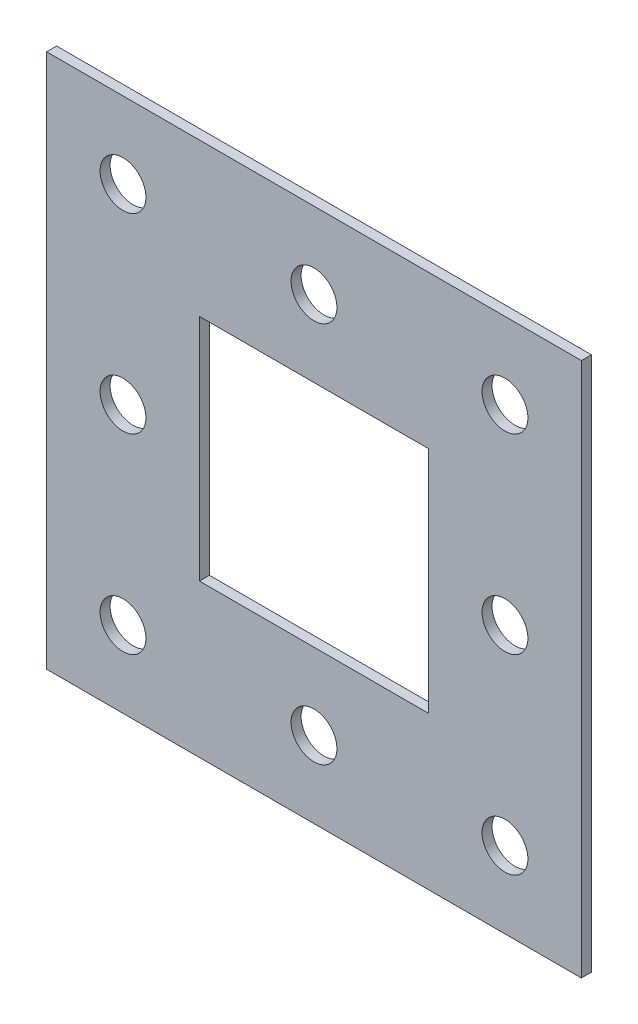
ISO-10303-21;
HEADER;
FILE_DESCRIPTION(('STEP AP214'),'2;1');
FILE_NAME('part.step','',(''),(''),'','','');
FILE_SCHEMA(('AUTOMOTIVE_DESIGN { 1 0 10303 214 1 1 1 1 }'));
ENDSEC;
DATA;
#1=APPLICATION_CONTEXT('core data for automotive mechanical design processes');
#2=APPLICATION_PROTOCOL_DEFINITION('international standard','automotive_design',2000,#1);
#3=PRODUCT_CONTEXT('',#1,'mechanical');
#4=PRODUCT('Part','Part','',(#3));
#5=PRODUCT_RELATED_PRODUCT_CATEGORY('part','',(#4));
#6=PRODUCT_DEFINITION_FORMATION('','',#4);
#7=PRODUCT_DEFINITION_CONTEXT('part definition',#1,'design');
#8=PRODUCT_DEFINITION('design','',#6,#7);
#9=PRODUCT_DEFINITION_SHAPE('','',#8);
#10=(LENGTH_UNIT() NAMED_UNIT(*) SI_UNIT(.MILLI.,.METRE.));
#11=(NAMED_UNIT(*) PLANE_ANGLE_UNIT() SI_UNIT($,.RADIAN.));
#12=(NAMED_UNIT(*) SI_UNIT($,.STERADIAN.) SOLID_ANGLE_UNIT());
#13=UNCERTAINTY_MEASURE_WITH_UNIT(LENGTH_MEASURE(1.E-05),#10,'distance_accuracy_value','');
#14=(GEOMETRIC_REPRESENTATION_CONTEXT(3) GLOBAL_UNCERTAINTY_ASSIGNED_CONTEXT((#13)) GLOBAL_UNIT_ASSIGNED_CONTEXT((#10,
#11,#12)) REPRESENTATION_CONTEXT('',''));
#15=CARTESIAN_POINT('',(0.,0.,0.));
#16=DIRECTION('',(0.,0.,1.));
#17=DIRECTION('',(1.,0.,0.));
#18=AXIS2_PLACEMENT_3D('',#15,#16,#17);
#19=CARTESIAN_POINT('',(35.,-35.,1.31));
#20=DIRECTION('',(-1.,0.,0.));
#21=DIRECTION('',(0.,0.,1.));
#22=AXIS2_PLACEMENT_3D('',#19,#20,#21);
#23=PLANE('',#22);
#24=DIRECTION('',(0.,1.,0.));
#25=VECTOR('',#24,1.);
#26=CARTESIAN_POINT('',(35.,-35.,0.));
#27=LINE('',#26,#25);
#28=CARTESIAN_POINT('',(35.,-35.,0.));
#29=VERTEX_POINT('',#28);
#30=CARTESIAN_POINT('',(35.,35.,0.));
#31=VERTEX_POINT('',#30);
#32=EDGE_CURVE('E155',#29,#31,#27,.T.);
#33=ORIENTED_EDGE('',*,*,#32,.T.);
#34=DIRECTION('',(0.,0.,-1.));
#35=VECTOR('',#34,1.);
#36=CARTESIAN_POINT('',(35.,35.,1.31));
#37=LINE('',#36,#35);
#38=CARTESIAN_POINT('',(35.,35.,1.31));
#39=VERTEX_POINT('',#38);
#40=EDGE_CURVE('E182',#39,#31,#37,.T.);
#41=ORIENTED_EDGE('',*,*,#40,.F.);
#42=DIRECTION('',(0.,1.,0.));
#43=VECTOR('',#42,1.);
#44=CARTESIAN_POINT('',(35.,-35.,1.31));
#45=LINE('',#44,#43);
#46=CARTESIAN_POINT('',(35.,-35.,1.31));
#47=VERTEX_POINT('',#46);
#48=EDGE_CURVE('E156',#47,#39,#45,.T.);
#49=ORIENTED_EDGE('',*,*,#48,.F.);
#50=DIRECTION('',(0.,0.,-1.));
#51=VECTOR('',#50,1.);
#52=CARTESIAN_POINT('',(35.,-35.,1.31));
#53=LINE('',#52,#51);
#54=EDGE_CURVE('E166',#47,#29,#53,.T.);
#55=ORIENTED_EDGE('',*,*,#54,.T.);
#56=EDGE_LOOP('',(#33,#41,#49,#55));
#57=FACE_BOUND('',#56,.T.);
#58=ADVANCED_FACE('F35',(#57),#23,.F.);
#59=CARTESIAN_POINT('',(-35.,35.,1.31));
#60=DIRECTION('',(0.,-1.,0.));
#61=DIRECTION('',(0.,0.,-1.));
#62=AXIS2_PLACEMENT_3D('',#59,#60,#61);
#63=PLANE('',#62);
#64=DIRECTION('',(-1.,0.,0.));
#65=VECTOR('',#64,1.);
#66=CARTESIAN_POINT('',(-35.,35.,0.));
#67=LINE('',#66,#65);
#68=CARTESIAN_POINT('',(-35.,35.,0.));
#69=VERTEX_POINT('',#68);
#70=EDGE_CURVE('E169',#31,#69,#67,.T.);
#71=ORIENTED_EDGE('',*,*,#70,.T.);
#72=DIRECTION('',(0.,0.,-1.));
#73=VECTOR('',#72,1.);
#74=CARTESIAN_POINT('',(-35.,35.,1.31));
#75=LINE('',#74,#73);
#76=CARTESIAN_POINT('',(-35.,35.,1.31));
#77=VERTEX_POINT('',#76);
#78=EDGE_CURVE('E179',#77,#69,#75,.T.);
#79=ORIENTED_EDGE('',*,*,#78,.F.);
#80=DIRECTION('',(-1.,0.,0.));
#81=VECTOR('',#80,1.);
#82=CARTESIAN_POINT('',(-35.,35.,1.31));
#83=LINE('',#82,#81);
#84=EDGE_CURVE('E159',#39,#77,#83,.T.);
#85=ORIENTED_EDGE('',*,*,#84,.F.);
#86=ORIENTED_EDGE('',*,*,#40,.T.);
#87=EDGE_LOOP('',(#71,#79,#85,#86));
#88=FACE_BOUND('',#87,.T.);
#89=ADVANCED_FACE('F243',(#88),#63,.F.);
#90=CARTESIAN_POINT('',(-35.,-35.,1.31));
#91=DIRECTION('',(1.,0.,0.));
#92=DIRECTION('',(0.,0.,-1.));
#93=AXIS2_PLACEMENT_3D('',#90,#91,#92);
#94=PLANE('',#93);
#95=DIRECTION('',(0.,-1.,0.));
#96=VECTOR('',#95,1.);
#97=CARTESIAN_POINT('',(-35.,-35.,0.));
#98=LINE('',#97,#96);
#99=CARTESIAN_POINT('',(-35.,-35.,0.));
#100=VERTEX_POINT('',#99);
#101=EDGE_CURVE('E171',#69,#100,#98,.T.);
#102=ORIENTED_EDGE('',*,*,#101,.T.);
#103=DIRECTION('',(0.,0.,-1.));
#104=VECTOR('',#103,1.);
#105=CARTESIAN_POINT('',(-35.,-35.,1.31));
#106=LINE('',#105,#104);
#107=CARTESIAN_POINT('',(-35.,-35.,1.31));
#108=VERTEX_POINT('',#107);
#109=EDGE_CURVE('E176',#108,#100,#106,.T.);
#110=ORIENTED_EDGE('',*,*,#109,.F.);
#111=DIRECTION('',(0.,-1.,0.));
#112=VECTOR('',#111,1.);
#113=CARTESIAN_POINT('',(-35.,-35.,1.31));
#114=LINE('',#113,#112);
#115=EDGE_CURVE('E162',#77,#108,#114,.T.);
#116=ORIENTED_EDGE('',*,*,#115,.F.);
#117=ORIENTED_EDGE('',*,*,#78,.T.);
#118=EDGE_LOOP('',(#102,#110,#116,#117));
#119=FACE_BOUND('',#118,.T.);
#120=ADVANCED_FACE('F240',(#119),#94,.F.);
#121=CARTESIAN_POINT('',(-35.,-35.,1.31));
#122=DIRECTION('',(0.,1.,0.));
#123=DIRECTION('',(0.,0.,1.));
#124=AXIS2_PLACEMENT_3D('',#121,#122,#123);
#125=PLANE('',#124);
#126=DIRECTION('',(1.,0.,0.));
#127=VECTOR('',#126,1.);
#128=CARTESIAN_POINT('',(-35.,-35.,0.));
#129=LINE('',#128,#127);
#130=EDGE_CURVE('E160',#100,#29,#129,.T.);
#131=ORIENTED_EDGE('',*,*,#130,.T.);
#132=ORIENTED_EDGE('',*,*,#54,.F.);
#133=DIRECTION('',(1.,0.,0.));
#134=VECTOR('',#133,1.);
#135=CARTESIAN_POINT('',(-35.,-35.,1.31));
#136=LINE('',#135,#134);
#137=EDGE_CURVE('E164',#108,#47,#136,.T.);
#138=ORIENTED_EDGE('',*,*,#137,.F.);
#139=ORIENTED_EDGE('',*,*,#109,.T.);
#140=EDGE_LOOP('',(#131,#132,#138,#139));
#141=FACE_BOUND('',#140,.T.);
#142=ADVANCED_FACE('F236',(#141),#125,.F.);
#143=CARTESIAN_POINT('',(0.,0.,1.31));
#144=DIRECTION('',(0.,0.,-1.));
#145=DIRECTION('',(-1.,0.,0.));
#146=AXIS2_PLACEMENT_3D('',#143,#144,#145);
#147=PLANE('',#146);
#148=CARTESIAN_POINT('',(-25.,25.,1.31));
#149=DIRECTION('',(0.,0.,-1.));
#150=DIRECTION('',(-1.,0.,0.));
#151=AXIS2_PLACEMENT_3D('',#148,#149,#150);
#152=CIRCLE('',#151,3.);
#153=CARTESIAN_POINT('',(-28.,25.,1.31));
#154=VERTEX_POINT('',#153);
#155=EDGE_CURVE('E152',#154,#154,#152,.T.);
#156=ORIENTED_EDGE('',*,*,#155,.T.);
#157=EDGE_LOOP('',(#156));
#158=FACE_BOUND('',#157,.T.);
#159=CARTESIAN_POINT('',(0.,25.,1.31));
#160=DIRECTION('',(0.,0.,-1.));
#161=DIRECTION('',(-1.,0.,0.));
#162=AXIS2_PLACEMENT_3D('',#159,#160,#161);
#163=CIRCLE('',#162,3.);
#164=CARTESIAN_POINT('',(-2.99999999999999,25.,1.31));
#165=VERTEX_POINT('',#164);
#166=EDGE_CURVE('E149',#165,#165,#163,.T.);
#167=ORIENTED_EDGE('',*,*,#166,.T.);
#168=EDGE_LOOP('',(#167));
#169=FACE_BOUND('',#168,.T.);
#170=CARTESIAN_POINT('',(25.,25.,1.31));
#171=DIRECTION('',(0.,0.,-1.));
#172=DIRECTION('',(-1.,0.,0.));
#173=AXIS2_PLACEMENT_3D('',#170,#171,#172);
#174=CIRCLE('',#173,3.);
#175=CARTESIAN_POINT('',(22.,25.,1.31));
#176=VERTEX_POINT('',#175);
#177=EDGE_CURVE('E145',#176,#176,#174,.T.);
#178=ORIENTED_EDGE('',*,*,#177,.T.);
#179=EDGE_LOOP('',(#178));
#180=FACE_BOUND('',#179,.T.);
#181=CARTESIAN_POINT('',(25.,0.,1.31));
#182=DIRECTION('',(0.,0.,-1.));
#183=DIRECTION('',(-1.,0.,0.));
#184=AXIS2_PLACEMENT_3D('',#181,#182,#183);
#185=CIRCLE('',#184,3.);
#186=CARTESIAN_POINT('',(22.,0.,1.31));
#187=VERTEX_POINT('',#186);
#188=EDGE_CURVE('E141',#187,#187,#185,.T.);
#189=ORIENTED_EDGE('',*,*,#188,.T.);
#190=EDGE_LOOP('',(#189));
#191=FACE_BOUND('',#190,.T.);
#192=CARTESIAN_POINT('',(25.,-25.,1.31));
#193=DIRECTION('',(0.,0.,-1.));
#194=DIRECTION('',(-1.,0.,0.));
#195=AXIS2_PLACEMENT_3D('',#192,#193,#194);
#196=CIRCLE('',#195,3.);
#197=CARTESIAN_POINT('',(22.,-25.,1.31));
#198=VERTEX_POINT('',#197);
#199=EDGE_CURVE('E137',#198,#198,#196,.T.);
#200=ORIENTED_EDGE('',*,*,#199,.T.);
#201=EDGE_LOOP('',(#200));
#202=FACE_BOUND('',#201,.T.);
#203=CARTESIAN_POINT('',(0.,-25.,1.31));
#204=DIRECTION('',(0.,0.,-1.));
#205=DIRECTION('',(-1.,0.,0.));
#206=AXIS2_PLACEMENT_3D('',#203,#204,#205);
#207=CIRCLE('',#206,3.);
#208=CARTESIAN_POINT('',(-2.99999999999999,-25.,1.31));
#209=VERTEX_POINT('',#208);
#210=EDGE_CURVE('E133',#209,#209,#207,.T.);
#211=ORIENTED_EDGE('',*,*,#210,.T.);
#212=EDGE_LOOP('',(#211));
#213=FACE_BOUND('',#212,.T.);
#214=CARTESIAN_POINT('',(-25.,-25.,1.31));
#215=DIRECTION('',(0.,0.,-1.));
#216=DIRECTION('',(-1.,0.,0.));
#217=AXIS2_PLACEMENT_3D('',#214,#215,#216);
#218=CIRCLE('',#217,3.);
#219=CARTESIAN_POINT('',(-28.,-25.,1.31));
#220=VERTEX_POINT('',#219);
#221=EDGE_CURVE('E129',#220,#220,#218,.T.);
#222=ORIENTED_EDGE('',*,*,#221,.T.);
#223=EDGE_LOOP('',(#222));
#224=FACE_BOUND('',#223,.T.);
#225=CARTESIAN_POINT('',(-25.,0.,1.31));
#226=DIRECTION('',(0.,0.,-1.));
#227=DIRECTION('',(-1.,0.,0.));
#228=AXIS2_PLACEMENT_3D('',#225,#226,#227);
#229=CIRCLE('',#228,3.);
#230=CARTESIAN_POINT('',(-28.,0.,1.31));
#231=VERTEX_POINT('',#230);
#232=EDGE_CURVE('E125',#231,#231,#229,.T.);
#233=ORIENTED_EDGE('',*,*,#232,.T.);
#234=EDGE_LOOP('',(#233));
#235=FACE_BOUND('',#234,.T.);
#236=DIRECTION('',(1.,0.,0.));
#237=VECTOR('',#236,1.);
#238=CARTESIAN_POINT('',(0.,15.,1.31));
#239=LINE('',#238,#237);
#240=CARTESIAN_POINT('',(-15.,15.,1.31));
#241=VERTEX_POINT('',#240);
#242=CARTESIAN_POINT('',(15.,15.,1.31));
#243=VERTEX_POINT('',#242);
#244=EDGE_CURVE('E97',#241,#243,#239,.T.);
#245=ORIENTED_EDGE('',*,*,#244,.T.);
#246=DIRECTION('',(0.,-1.,0.));
#247=VECTOR('',#246,1.);
#248=CARTESIAN_POINT('',(15.,0.,1.31));
#249=LINE('',#248,#247);
#250=CARTESIAN_POINT('',(15.,-15.,1.31));
#251=VERTEX_POINT('',#250);
#252=EDGE_CURVE('E119',#243,#251,#249,.T.);
#253=ORIENTED_EDGE('',*,*,#252,.T.);
#254=DIRECTION('',(-1.,0.,0.));
#255=VECTOR('',#254,1.);
#256=CARTESIAN_POINT('',(0.,-15.,1.31));
#257=LINE('',#256,#255);
#258=CARTESIAN_POINT('',(-15.,-15.,1.31));
#259=VERTEX_POINT('',#258);
#260=EDGE_CURVE('E117',#251,#259,#257,.T.);
#261=ORIENTED_EDGE('',*,*,#260,.T.);
#262=DIRECTION('',(0.,1.,0.));
#263=VECTOR('',#262,1.);
#264=CARTESIAN_POINT('',(-15.,0.,1.31));
#265=LINE('',#264,#263);
#266=EDGE_CURVE('E102',#259,#241,#265,.T.);
#267=ORIENTED_EDGE('',*,*,#266,.T.);
#268=EDGE_LOOP('',(#245,#253,#261,#267));
#269=FACE_BOUND('',#268,.T.);
#270=ORIENTED_EDGE('',*,*,#48,.T.);
#271=ORIENTED_EDGE('',*,*,#84,.T.);
#272=ORIENTED_EDGE('',*,*,#115,.T.);
#273=ORIENTED_EDGE('',*,*,#137,.T.);
#274=EDGE_LOOP('',(#270,#271,#272,#273));
#275=FACE_BOUND('',#274,.T.);
#276=ADVANCED_FACE('F115',(#158,#169,#180,#191,#202,#213,#224,#235,#269,#275),#147,.F.);
#277=CARTESIAN_POINT('',(0.,0.,0.));
#278=DIRECTION('',(0.,0.,-1.));
#279=DIRECTION('',(-1.,0.,0.));
#280=AXIS2_PLACEMENT_3D('',#277,#278,#279);
#281=PLANE('',#280);
#282=CARTESIAN_POINT('',(-25.,25.,0.));
#283=DIRECTION('',(0.,0.,-1.));
#284=DIRECTION('',(-1.,0.,0.));
#285=AXIS2_PLACEMENT_3D('',#282,#283,#284);
#286=CIRCLE('',#285,3.);
#287=CARTESIAN_POINT('',(-28.,25.,0.));
#288=VERTEX_POINT('',#287);
#289=EDGE_CURVE('E38',#288,#288,#286,.T.);
#290=ORIENTED_EDGE('',*,*,#289,.F.);
#291=EDGE_LOOP('',(#290));
#292=FACE_BOUND('',#291,.T.);
#293=CARTESIAN_POINT('',(0.,25.,0.));
#294=DIRECTION('',(0.,0.,-1.));
#295=DIRECTION('',(-1.,0.,0.));
#296=AXIS2_PLACEMENT_3D('',#293,#294,#295);
#297=CIRCLE('',#296,3.);
#298=CARTESIAN_POINT('',(-2.99999999999999,25.,0.));
#299=VERTEX_POINT('',#298);
#300=EDGE_CURVE('E148',#299,#299,#297,.T.);
#301=ORIENTED_EDGE('',*,*,#300,.F.);
#302=EDGE_LOOP('',(#301));
#303=FACE_BOUND('',#302,.T.);
#304=CARTESIAN_POINT('',(25.,25.,0.));
#305=DIRECTION('',(0.,0.,-1.));
#306=DIRECTION('',(-1.,0.,0.));
#307=AXIS2_PLACEMENT_3D('',#304,#305,#306);
#308=CIRCLE('',#307,3.);
#309=CARTESIAN_POINT('',(22.,25.,0.));
#310=VERTEX_POINT('',#309);
#311=EDGE_CURVE('E144',#310,#310,#308,.T.);
#312=ORIENTED_EDGE('',*,*,#311,.F.);
#313=EDGE_LOOP('',(#312));
#314=FACE_BOUND('',#313,.T.);
#315=CARTESIAN_POINT('',(25.,0.,0.));
#316=DIRECTION('',(0.,0.,-1.));
#317=DIRECTION('',(-1.,0.,0.));
#318=AXIS2_PLACEMENT_3D('',#315,#316,#317);
#319=CIRCLE('',#318,3.);
#320=CARTESIAN_POINT('',(22.,0.,0.));
#321=VERTEX_POINT('',#320);
#322=EDGE_CURVE('E140',#321,#321,#319,.T.);
#323=ORIENTED_EDGE('',*,*,#322,.F.);
#324=EDGE_LOOP('',(#323));
#325=FACE_BOUND('',#324,.T.);
#326=CARTESIAN_POINT('',(25.,-25.,0.));
#327=DIRECTION('',(0.,0.,-1.));
#328=DIRECTION('',(-1.,0.,0.));
#329=AXIS2_PLACEMENT_3D('',#326,#327,#328);
#330=CIRCLE('',#329,3.);
#331=CARTESIAN_POINT('',(22.,-25.,0.));
#332=VERTEX_POINT('',#331);
#333=EDGE_CURVE('E136',#332,#332,#330,.T.);
#334=ORIENTED_EDGE('',*,*,#333,.F.);
#335=EDGE_LOOP('',(#334));
#336=FACE_BOUND('',#335,.T.);
#337=CARTESIAN_POINT('',(0.,-25.,0.));
#338=DIRECTION('',(0.,0.,-1.));
#339=DIRECTION('',(-1.,0.,0.));
#340=AXIS2_PLACEMENT_3D('',#337,#338,#339);
#341=CIRCLE('',#340,3.);
#342=CARTESIAN_POINT('',(-2.99999999999999,-25.,0.));
#343=VERTEX_POINT('',#342);
#344=EDGE_CURVE('E132',#343,#343,#341,.T.);
#345=ORIENTED_EDGE('',*,*,#344,.F.);
#346=EDGE_LOOP('',(#345));
#347=FACE_BOUND('',#346,.T.);
#348=CARTESIAN_POINT('',(-25.,-25.,0.));
#349=DIRECTION('',(0.,0.,-1.));
#350=DIRECTION('',(-1.,0.,0.));
#351=AXIS2_PLACEMENT_3D('',#348,#349,#350);
#352=CIRCLE('',#351,3.);
#353=CARTESIAN_POINT('',(-28.,-25.,0.));
#354=VERTEX_POINT('',#353);
#355=EDGE_CURVE('E128',#354,#354,#352,.T.);
#356=ORIENTED_EDGE('',*,*,#355,.F.);
#357=EDGE_LOOP('',(#356));
#358=FACE_BOUND('',#357,.T.);
#359=CARTESIAN_POINT('',(-25.,0.,0.));
#360=DIRECTION('',(0.,0.,-1.));
#361=DIRECTION('',(-1.,0.,0.));
#362=AXIS2_PLACEMENT_3D('',#359,#360,#361);
#363=CIRCLE('',#362,3.);
#364=CARTESIAN_POINT('',(-28.,0.,0.));
#365=VERTEX_POINT('',#364);
#366=EDGE_CURVE('E124',#365,#365,#363,.T.);
#367=ORIENTED_EDGE('',*,*,#366,.F.);
#368=EDGE_LOOP('',(#367));
#369=FACE_BOUND('',#368,.T.);
#370=DIRECTION('',(0.,-1.,0.));
#371=VECTOR('',#370,1.);
#372=CARTESIAN_POINT('',(15.,0.,0.));
#373=LINE('',#372,#371);
#374=CARTESIAN_POINT('',(15.,15.,0.));
#375=VERTEX_POINT('',#374);
#376=CARTESIAN_POINT('',(15.,-15.,0.));
#377=VERTEX_POINT('',#376);
#378=EDGE_CURVE('E11',#375,#377,#373,.T.);
#379=ORIENTED_EDGE('',*,*,#378,.F.);
#380=DIRECTION('',(1.,0.,0.));
#381=VECTOR('',#380,1.);
#382=CARTESIAN_POINT('',(0.,15.,0.));
#383=LINE('',#382,#381);
#384=CARTESIAN_POINT('',(-15.,15.,0.));
#385=VERTEX_POINT('',#384);
#386=EDGE_CURVE('E185',#385,#375,#383,.T.);
#387=ORIENTED_EDGE('',*,*,#386,.F.);
#388=DIRECTION('',(0.,1.,0.));
#389=VECTOR('',#388,1.);
#390=CARTESIAN_POINT('',(-15.,0.,0.));
#391=LINE('',#390,#389);
#392=CARTESIAN_POINT('',(-15.,-15.,0.));
#393=VERTEX_POINT('',#392);
#394=EDGE_CURVE('E110',#393,#385,#391,.T.);
#395=ORIENTED_EDGE('',*,*,#394,.F.);
#396=DIRECTION('',(-1.,0.,0.));
#397=VECTOR('',#396,1.);
#398=CARTESIAN_POINT('',(0.,-15.,0.));
#399=LINE('',#398,#397);
#400=EDGE_CURVE('E43',#377,#393,#399,.T.);
#401=ORIENTED_EDGE('',*,*,#400,.F.);
#402=EDGE_LOOP('',(#379,#387,#395,#401));
#403=FACE_BOUND('',#402,.T.);
#404=ORIENTED_EDGE('',*,*,#32,.F.);
#405=ORIENTED_EDGE('',*,*,#130,.F.);
#406=ORIENTED_EDGE('',*,*,#101,.F.);
#407=ORIENTED_EDGE('',*,*,#70,.F.);
#408=EDGE_LOOP('',(#404,#405,#406,#407));
#409=FACE_BOUND('',#408,.T.);
#410=ADVANCED_FACE('F206',(#292,#303,#314,#325,#336,#347,#358,#369,#403,#409),#281,.T.);
#411=CARTESIAN_POINT('',(15.,-15.,-29.69));
#412=DIRECTION('',(1.,0.,0.));
#413=DIRECTION('',(0.,0.,-1.));
#414=AXIS2_PLACEMENT_3D('',#411,#412,#413);
#415=PLANE('',#414);
#416=DIRECTION('',(0.,0.,1.));
#417=VECTOR('',#416,1.);
#418=CARTESIAN_POINT('',(15.,15.,-29.69));
#419=LINE('',#418,#417);
#420=EDGE_CURVE('E51',#375,#243,#419,.T.);
#421=ORIENTED_EDGE('',*,*,#420,.F.);
#422=ORIENTED_EDGE('',*,*,#378,.T.);
#423=DIRECTION('',(0.,0.,1.));
#424=VECTOR('',#423,1.);
#425=CARTESIAN_POINT('',(15.,-15.,-29.69));
#426=LINE('',#425,#424);
#427=EDGE_CURVE('E103',#377,#251,#426,.T.);
#428=ORIENTED_EDGE('',*,*,#427,.T.);
#429=ORIENTED_EDGE('',*,*,#252,.F.);
#430=EDGE_LOOP('',(#421,#422,#428,#429));
#431=FACE_BOUND('',#430,.T.);
#432=ADVANCED_FACE('F209',(#431),#415,.F.);
#433=CARTESIAN_POINT('',(-15.,-15.,-29.69));
#434=DIRECTION('',(0.,-1.,0.));
#435=DIRECTION('',(0.,0.,-1.));
#436=AXIS2_PLACEMENT_3D('',#433,#434,#435);
#437=PLANE('',#436);
#438=ORIENTED_EDGE('',*,*,#427,.F.);
#439=ORIENTED_EDGE('',*,*,#400,.T.);
#440=DIRECTION('',(0.,0.,1.));
#441=VECTOR('',#440,1.);
#442=CARTESIAN_POINT('',(-15.,-15.,-29.69));
#443=LINE('',#442,#441);
#444=EDGE_CURVE('E112',#393,#259,#443,.T.);
#445=ORIENTED_EDGE('',*,*,#444,.T.);
#446=ORIENTED_EDGE('',*,*,#260,.F.);
#447=EDGE_LOOP('',(#438,#439,#445,#446));
#448=FACE_BOUND('',#447,.T.);
#449=ADVANCED_FACE('F286',(#448),#437,.F.);
#450=CARTESIAN_POINT('',(-15.,-15.,-29.69));
#451=DIRECTION('',(-1.,0.,0.));
#452=DIRECTION('',(0.,0.,1.));
#453=AXIS2_PLACEMENT_3D('',#450,#451,#452);
#454=PLANE('',#453);
#455=ORIENTED_EDGE('',*,*,#444,.F.);
#456=ORIENTED_EDGE('',*,*,#394,.T.);
#457=DIRECTION('',(0.,0.,1.));
#458=VECTOR('',#457,1.);
#459=CARTESIAN_POINT('',(-15.,15.,-29.69));
#460=LINE('',#459,#458);
#461=EDGE_CURVE('E56',#385,#241,#460,.T.);
#462=ORIENTED_EDGE('',*,*,#461,.T.);
#463=ORIENTED_EDGE('',*,*,#266,.F.);
#464=EDGE_LOOP('',(#455,#456,#462,#463));
#465=FACE_BOUND('',#464,.T.);
#466=ADVANCED_FACE('F107',(#465),#454,.F.);
#467=CARTESIAN_POINT('',(-15.,15.,-29.69));
#468=DIRECTION('',(0.,1.,0.));
#469=DIRECTION('',(0.,0.,1.));
#470=AXIS2_PLACEMENT_3D('',#467,#468,#469);
#471=PLANE('',#470);
#472=ORIENTED_EDGE('',*,*,#461,.F.);
#473=ORIENTED_EDGE('',*,*,#386,.T.);
#474=ORIENTED_EDGE('',*,*,#420,.T.);
#475=ORIENTED_EDGE('',*,*,#244,.F.);
#476=EDGE_LOOP('',(#472,#473,#474,#475));
#477=FACE_BOUND('',#476,.T.);
#478=ADVANCED_FACE('F98',(#477),#471,.F.);
#479=CARTESIAN_POINT('',(-25.,0.,-29.69));
#480=DIRECTION('',(0.,0.,1.));
#481=DIRECTION('',(1.,0.,0.));
#482=AXIS2_PLACEMENT_3D('',#479,#480,#481);
#483=CYLINDRICAL_SURFACE('',#482,3.);
#484=ORIENTED_EDGE('',*,*,#366,.T.);
#485=EDGE_LOOP('',(#484));
#486=FACE_BOUND('',#485,.T.);
#487=ORIENTED_EDGE('',*,*,#232,.F.);
#488=EDGE_LOOP('',(#487));
#489=FACE_BOUND('',#488,.T.);
#490=ADVANCED_FACE('F312',(#486,#489),#483,.F.);
#491=CARTESIAN_POINT('',(-25.,-25.,-29.69));
#492=DIRECTION('',(0.,0.,1.));
#493=DIRECTION('',(1.,0.,0.));
#494=AXIS2_PLACEMENT_3D('',#491,#492,#493);
#495=CYLINDRICAL_SURFACE('',#494,3.);
#496=ORIENTED_EDGE('',*,*,#355,.T.);
#497=EDGE_LOOP('',(#496));
#498=FACE_BOUND('',#497,.T.);
#499=ORIENTED_EDGE('',*,*,#221,.F.);
#500=EDGE_LOOP('',(#499));
#501=FACE_BOUND('',#500,.T.);
#502=ADVANCED_FACE('F321',(#498,#501),#495,.F.);
#503=CARTESIAN_POINT('',(0.,-25.,-29.69));
#504=DIRECTION('',(0.,0.,1.));
#505=DIRECTION('',(1.,0.,0.));
#506=AXIS2_PLACEMENT_3D('',#503,#504,#505);
#507=CYLINDRICAL_SURFACE('',#506,3.);
#508=ORIENTED_EDGE('',*,*,#344,.T.);
#509=EDGE_LOOP('',(#508));
#510=FACE_BOUND('',#509,.T.);
#511=ORIENTED_EDGE('',*,*,#210,.F.);
#512=EDGE_LOOP('',(#511));
#513=FACE_BOUND('',#512,.T.);
#514=ADVANCED_FACE('F331',(#510,#513),#507,.F.);
#515=CARTESIAN_POINT('',(25.,-25.,-29.69));
#516=DIRECTION('',(0.,0.,1.));
#517=DIRECTION('',(1.,0.,0.));
#518=AXIS2_PLACEMENT_3D('',#515,#516,#517);
#519=CYLINDRICAL_SURFACE('',#518,3.);
#520=ORIENTED_EDGE('',*,*,#333,.T.);
#521=EDGE_LOOP('',(#520));
#522=FACE_BOUND('',#521,.T.);
#523=ORIENTED_EDGE('',*,*,#199,.F.);
#524=EDGE_LOOP('',(#523));
#525=FACE_BOUND('',#524,.T.);
#526=ADVANCED_FACE('F341',(#522,#525),#519,.F.);
#527=CARTESIAN_POINT('',(25.,0.,-29.69));
#528=DIRECTION('',(0.,0.,1.));
#529=DIRECTION('',(1.,0.,0.));
#530=AXIS2_PLACEMENT_3D('',#527,#528,#529);
#531=CYLINDRICAL_SURFACE('',#530,3.);
#532=ORIENTED_EDGE('',*,*,#322,.T.);
#533=EDGE_LOOP('',(#532));
#534=FACE_BOUND('',#533,.T.);
#535=ORIENTED_EDGE('',*,*,#188,.F.);
#536=EDGE_LOOP('',(#535));
#537=FACE_BOUND('',#536,.T.);
#538=ADVANCED_FACE('F351',(#534,#537),#531,.F.);
#539=CARTESIAN_POINT('',(25.,25.,-29.69));
#540=DIRECTION('',(0.,0.,1.));
#541=DIRECTION('',(1.,0.,0.));
#542=AXIS2_PLACEMENT_3D('',#539,#540,#541);
#543=CYLINDRICAL_SURFACE('',#542,3.);
#544=ORIENTED_EDGE('',*,*,#311,.T.);
#545=EDGE_LOOP('',(#544));
#546=FACE_BOUND('',#545,.T.);
#547=ORIENTED_EDGE('',*,*,#177,.F.);
#548=EDGE_LOOP('',(#547));
#549=FACE_BOUND('',#548,.T.);
#550=ADVANCED_FACE('F361',(#546,#549),#543,.F.);
#551=CARTESIAN_POINT('',(0.,25.,-29.69));
#552=DIRECTION('',(0.,0.,1.));
#553=DIRECTION('',(1.,0.,0.));
#554=AXIS2_PLACEMENT_3D('',#551,#552,#553);
#555=CYLINDRICAL_SURFACE('',#554,3.);
#556=ORIENTED_EDGE('',*,*,#300,.T.);
#557=EDGE_LOOP('',(#556));
#558=FACE_BOUND('',#557,.T.);
#559=ORIENTED_EDGE('',*,*,#166,.F.);
#560=EDGE_LOOP('',(#559));
#561=FACE_BOUND('',#560,.T.);
#562=ADVANCED_FACE('F203',(#558,#561),#555,.F.);
#563=CARTESIAN_POINT('',(-25.,25.,-29.69));
#564=DIRECTION('',(0.,0.,1.));
#565=DIRECTION('',(1.,0.,0.));
#566=AXIS2_PLACEMENT_3D('',#563,#564,#565);
#567=CYLINDRICAL_SURFACE('',#566,3.);
#568=ORIENTED_EDGE('',*,*,#289,.T.);
#569=EDGE_LOOP('',(#568));
#570=FACE_BOUND('',#569,.T.);
#571=ORIENTED_EDGE('',*,*,#155,.F.);
#572=EDGE_LOOP('',(#571));
#573=FACE_BOUND('',#572,.T.);
#574=ADVANCED_FACE('F380',(#570,#573),#567,.F.);
#575=CLOSED_SHELL('',(#58,#89,#120,#142,#276,#410,#432,#449,#466,#478,#490,#502,#514,#526,#538,
#550,#562,#574));
#576=MANIFOLD_SOLID_BREP('B2',#575);
#577=ADVANCED_BREP_SHAPE_REPRESENTATION('',(#18,#576),#14);
#578=SHAPE_DEFINITION_REPRESENTATION(#9,#577);
ENDSEC;
END-ISO-10303-21;
